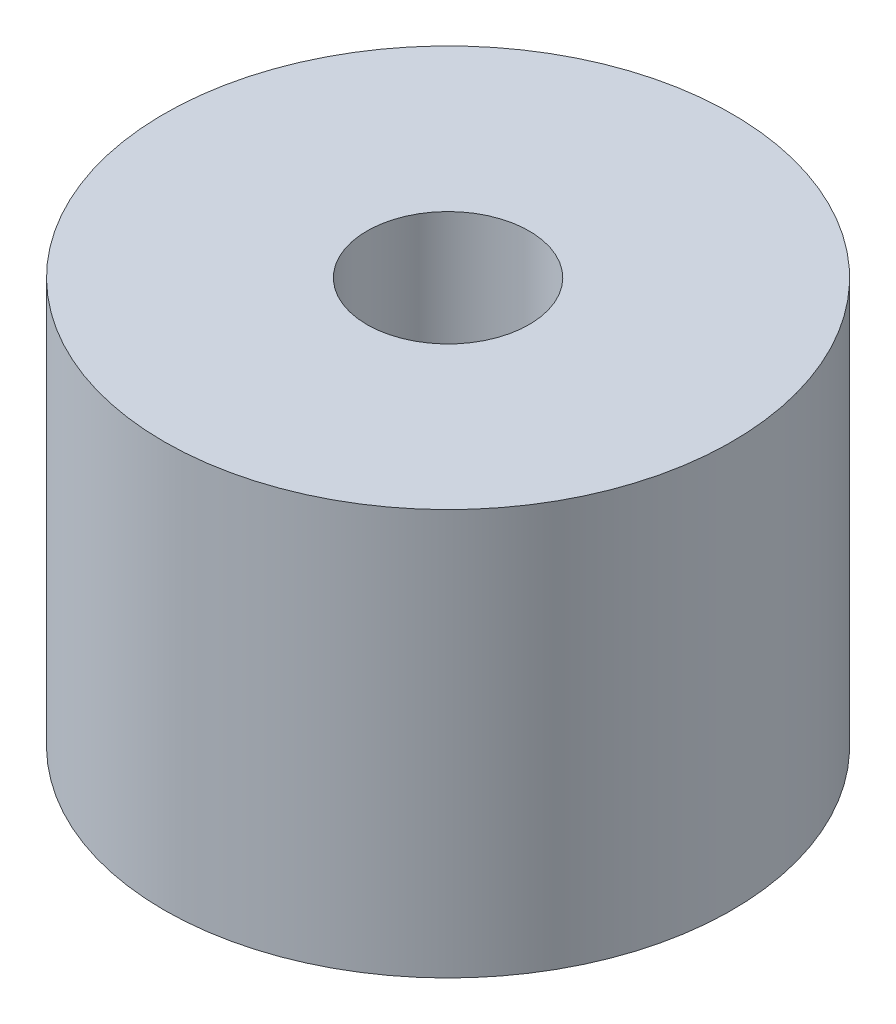
ISO-10303-21;
HEADER;
FILE_DESCRIPTION(('STEP AP214'),'2;1');
FILE_NAME('part.step','',(''),(''),'','','');
FILE_SCHEMA(('AUTOMOTIVE_DESIGN { 1 0 10303 214 1 1 1 1 }'));
ENDSEC;
DATA;
#1=APPLICATION_CONTEXT('core data for automotive mechanical design processes');
#2=APPLICATION_PROTOCOL_DEFINITION('international standard','automotive_design',2000,#1);
#3=PRODUCT_CONTEXT('',#1,'mechanical');
#4=PRODUCT('Part','Part','',(#3));
#5=PRODUCT_RELATED_PRODUCT_CATEGORY('part','',(#4));
#6=PRODUCT_DEFINITION_FORMATION('','',#4);
#7=PRODUCT_DEFINITION_CONTEXT('part definition',#1,'design');
#8=PRODUCT_DEFINITION('design','',#6,#7);
#9=PRODUCT_DEFINITION_SHAPE('','',#8);
#10=(LENGTH_UNIT() NAMED_UNIT(*) SI_UNIT(.MILLI.,.METRE.));
#11=(NAMED_UNIT(*) PLANE_ANGLE_UNIT() SI_UNIT($,.RADIAN.));
#12=(NAMED_UNIT(*) SI_UNIT($,.STERADIAN.) SOLID_ANGLE_UNIT());
#13=UNCERTAINTY_MEASURE_WITH_UNIT(LENGTH_MEASURE(1.E-05),#10,'distance_accuracy_value','');
#14=(GEOMETRIC_REPRESENTATION_CONTEXT(3) GLOBAL_UNCERTAINTY_ASSIGNED_CONTEXT((#13)) GLOBAL_UNIT_ASSIGNED_CONTEXT((#10,
#11,#12)) REPRESENTATION_CONTEXT('',''));
#15=CARTESIAN_POINT('',(0.,0.,0.));
#16=DIRECTION('',(0.,0.,1.));
#17=DIRECTION('',(1.,0.,0.));
#18=AXIS2_PLACEMENT_3D('',#15,#16,#17);
#19=CARTESIAN_POINT('',(0.,5.,0.));
#20=DIRECTION('',(0.,1.,0.));
#21=DIRECTION('',(0.,0.,1.));
#22=AXIS2_PLACEMENT_3D('',#19,#20,#21);
#23=PLANE('',#22);
#24=CARTESIAN_POINT('',(0.,5.,0.));
#25=DIRECTION('',(0.,1.,0.));
#26=DIRECTION('',(0.,0.,1.));
#27=AXIS2_PLACEMENT_3D('',#24,#25,#26);
#28=CIRCLE('',#27,3.5);
#29=CARTESIAN_POINT('',(0.,5.,3.5));
#30=VERTEX_POINT('',#29);
#31=EDGE_CURVE('E10',#30,#30,#28,.T.);
#32=ORIENTED_EDGE('',*,*,#31,.T.);
#33=EDGE_LOOP('',(#32));
#34=FACE_BOUND('',#33,.T.);
#35=CARTESIAN_POINT('',(0.,5.,0.));
#36=DIRECTION('',(0.,1.,0.));
#37=DIRECTION('',(0.,0.,1.));
#38=AXIS2_PLACEMENT_3D('',#35,#36,#37);
#39=CIRCLE('',#38,1.);
#40=CARTESIAN_POINT('',(0.,5.,1.));
#41=VERTEX_POINT('',#40);
#42=EDGE_CURVE('E45',#41,#41,#39,.T.);
#43=ORIENTED_EDGE('',*,*,#42,.F.);
#44=EDGE_LOOP('',(#43));
#45=FACE_BOUND('',#44,.T.);
#46=ADVANCED_FACE('F34',(#34,#45),#23,.T.);
#47=CARTESIAN_POINT('',(0.,0.,0.));
#48=DIRECTION('',(0.,1.,0.));
#49=DIRECTION('',(0.,0.,1.));
#50=AXIS2_PLACEMENT_3D('',#47,#48,#49);
#51=PLANE('',#50);
#52=CARTESIAN_POINT('',(0.,0.,0.));
#53=DIRECTION('',(0.,1.,0.));
#54=DIRECTION('',(0.,0.,1.));
#55=AXIS2_PLACEMENT_3D('',#52,#53,#54);
#56=CIRCLE('',#55,3.5);
#57=CARTESIAN_POINT('',(0.,0.,3.5));
#58=VERTEX_POINT('',#57);
#59=EDGE_CURVE('E38',#58,#58,#56,.T.);
#60=ORIENTED_EDGE('',*,*,#59,.F.);
#61=EDGE_LOOP('',(#60));
#62=FACE_BOUND('',#61,.T.);
#63=CARTESIAN_POINT('',(0.,0.,0.));
#64=DIRECTION('',(0.,1.,0.));
#65=DIRECTION('',(0.,0.,1.));
#66=AXIS2_PLACEMENT_3D('',#63,#64,#65);
#67=CIRCLE('',#66,1.);
#68=CARTESIAN_POINT('',(0.,0.,1.));
#69=VERTEX_POINT('',#68);
#70=EDGE_CURVE('E47',#69,#69,#67,.T.);
#71=ORIENTED_EDGE('',*,*,#70,.T.);
#72=EDGE_LOOP('',(#71));
#73=FACE_BOUND('',#72,.T.);
#74=ADVANCED_FACE('F57',(#62,#73),#51,.F.);
#75=CARTESIAN_POINT('',(0.,5.,0.));
#76=DIRECTION('',(0.,-1.,0.));
#77=DIRECTION('',(0.,0.,-1.));
#78=AXIS2_PLACEMENT_3D('',#75,#76,#77);
#79=CYLINDRICAL_SURFACE('',#78,3.5);
#80=ORIENTED_EDGE('',*,*,#31,.F.);
#81=EDGE_LOOP('',(#80));
#82=FACE_BOUND('',#81,.T.);
#83=ORIENTED_EDGE('',*,*,#59,.T.);
#84=EDGE_LOOP('',(#83));
#85=FACE_BOUND('',#84,.T.);
#86=ADVANCED_FACE('F36',(#82,#85),#79,.T.);
#87=CARTESIAN_POINT('',(0.,5.,0.));
#88=DIRECTION('',(0.,-1.,0.));
#89=DIRECTION('',(0.,0.,-1.));
#90=AXIS2_PLACEMENT_3D('',#87,#88,#89);
#91=CYLINDRICAL_SURFACE('',#90,1.);
#92=ORIENTED_EDGE('',*,*,#42,.T.);
#93=EDGE_LOOP('',(#92));
#94=FACE_BOUND('',#93,.T.);
#95=ORIENTED_EDGE('',*,*,#70,.F.);
#96=EDGE_LOOP('',(#95));
#97=FACE_BOUND('',#96,.T.);
#98=ADVANCED_FACE('F53',(#94,#97),#91,.F.);
#99=CLOSED_SHELL('',(#46,#74,#86,#98));
#100=MANIFOLD_SOLID_BREP('B2',#99);
#101=ADVANCED_BREP_SHAPE_REPRESENTATION('',(#18,#100),#14);
#102=SHAPE_DEFINITION_REPRESENTATION(#9,#101);
ENDSEC;
END-ISO-10303-21;
